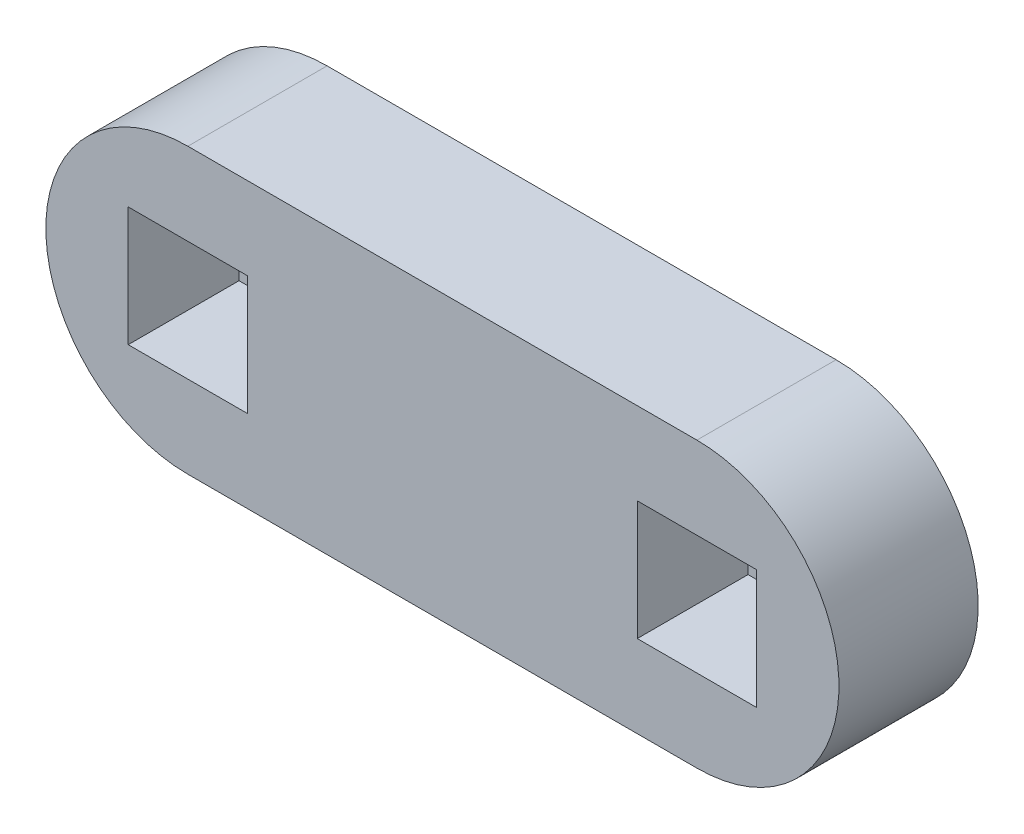
ISO-10303-21;
HEADER;
FILE_DESCRIPTION(('STEP AP214'),'2;1');
FILE_NAME('part.step','',(''),(''),'','','');
FILE_SCHEMA(('AUTOMOTIVE_DESIGN { 1 0 10303 214 1 1 1 1 }'));
ENDSEC;
DATA;
#1=APPLICATION_CONTEXT('core data for automotive mechanical design processes');
#2=APPLICATION_PROTOCOL_DEFINITION('international standard','automotive_design',2000,#1);
#3=PRODUCT_CONTEXT('',#1,'mechanical');
#4=PRODUCT('Part','Part','',(#3));
#5=PRODUCT_RELATED_PRODUCT_CATEGORY('part','',(#4));
#6=PRODUCT_DEFINITION_FORMATION('','',#4);
#7=PRODUCT_DEFINITION_CONTEXT('part definition',#1,'design');
#8=PRODUCT_DEFINITION('design','',#6,#7);
#9=PRODUCT_DEFINITION_SHAPE('','',#8);
#10=(LENGTH_UNIT() NAMED_UNIT(*) SI_UNIT(.MILLI.,.METRE.));
#11=(NAMED_UNIT(*) PLANE_ANGLE_UNIT() SI_UNIT($,.RADIAN.));
#12=(NAMED_UNIT(*) SI_UNIT($,.STERADIAN.) SOLID_ANGLE_UNIT());
#13=UNCERTAINTY_MEASURE_WITH_UNIT(LENGTH_MEASURE(1.E-05),#10,'distance_accuracy_value','');
#14=(GEOMETRIC_REPRESENTATION_CONTEXT(3) GLOBAL_UNCERTAINTY_ASSIGNED_CONTEXT((#13)) GLOBAL_UNIT_ASSIGNED_CONTEXT((#10,
#11,#12)) REPRESENTATION_CONTEXT('',''));
#15=CARTESIAN_POINT('',(0.,0.,0.));
#16=DIRECTION('',(0.,0.,1.));
#17=DIRECTION('',(1.,0.,0.));
#18=AXIS2_PLACEMENT_3D('',#15,#16,#17);
#19=CARTESIAN_POINT('',(-80.8551645809469,-10.4898062034838,247.548483736321));
#20=DIRECTION('',(0.,-1.,3.56992213568219E-13));
#21=DIRECTION('',(0.,-3.56992213568219E-13,-1.));
#22=AXIS2_PLACEMENT_3D('',#19,#20,#21);
#23=PLANE('',#22);
#24=DIRECTION('',(1.,0.,-1.90958360235527E-13));
#25=VECTOR('',#24,1.);
#26=CARTESIAN_POINT('',(-80.8551645810035,-10.4898062035897,-48.9999899999726));
#27=LINE('',#26,#25);
#28=CARTESIAN_POINT('',(-260.034313650781,-10.4898062035897,-48.9999899999554));
#29=VERTEX_POINT('',#28);
#30=CARTESIAN_POINT('',(-80.8551645809469,-10.4898062035897,-48.9999899999726));
#31=VERTEX_POINT('',#30);
#32=EDGE_CURVE('E11',#29,#31,#27,.T.);
#33=ORIENTED_EDGE('',*,*,#32,.F.);
#34=DIRECTION('',(-1.90958360235527E-13,-3.56992213568219E-13,-1.));
#35=VECTOR('',#34,1.);
#36=CARTESIAN_POINT('',(-260.034313650724,-10.4898062034838,247.548483736355));
#37=LINE('',#36,#35);
#38=CARTESIAN_POINT('',(-260.03431365079,-10.4898062036072,-97.9999899999384));
#39=VERTEX_POINT('',#38);
#40=EDGE_CURVE('E138',#29,#39,#37,.T.);
#41=ORIENTED_EDGE('',*,*,#40,.T.);
#42=DIRECTION('',(-1.,0.,1.9099669192392E-13));
#43=VECTOR('',#42,1.);
#44=CARTESIAN_POINT('',(-80.8551645810129,-10.4898062036072,-97.9999899999726));
#45=LINE('',#44,#43);
#46=CARTESIAN_POINT('',(-80.8551645810129,-10.4898062036072,-97.9999899999726));
#47=VERTEX_POINT('',#46);
#48=EDGE_CURVE('E152',#47,#39,#45,.T.);
#49=ORIENTED_EDGE('',*,*,#48,.F.);
#50=DIRECTION('',(-1.90958360235527E-13,-3.56992213568219E-13,-1.));
#51=VECTOR('',#50,1.);
#52=CARTESIAN_POINT('',(-80.8551645809469,-10.4898062034838,247.548483736321));
#53=LINE('',#52,#51);
#54=EDGE_CURVE('E215',#31,#47,#53,.T.);
#55=ORIENTED_EDGE('',*,*,#54,.F.);
#56=EDGE_LOOP('',(#33,#41,#49,#55));
#57=FACE_BOUND('',#56,.T.);
#58=ADVANCED_FACE('F33',(#57),#23,.T.);
#59=CARTESIAN_POINT('',(-260.034313650724,39.5101937965162,247.548483736337));
#60=DIRECTION('',(-1.90958360235527E-13,-3.56992213568219E-13,-1.));
#61=DIRECTION('',(0.,1.,-3.56992213568219E-13));
#62=AXIS2_PLACEMENT_3D('',#59,#60,#61);
#63=CYLINDRICAL_SURFACE('',#62,50.);
#64=CARTESIAN_POINT('',(-260.034313650781,39.5101937964103,-48.9999899999562));
#65=DIRECTION('',(-1.90958360235527E-13,-3.56744395928794E-13,-1.));
#66=DIRECTION('',(0.,1.,-3.56744395928794E-13));
#67=AXIS2_PLACEMENT_3D('',#64,#65,#66);
#68=CIRCLE('',#67,50.);
#69=CARTESIAN_POINT('',(-260.034313650781,89.5101937964103,-48.9999899999741));
#70=VERTEX_POINT('',#69);
#71=EDGE_CURVE('E134',#70,#29,#68,.F.);
#72=ORIENTED_EDGE('',*,*,#71,.F.);
#73=DIRECTION('',(-1.90958360235527E-13,-3.56992213568219E-13,-1.));
#74=VECTOR('',#73,1.);
#75=CARTESIAN_POINT('',(-260.034313650724,89.5101937965162,247.548483736319));
#76=LINE('',#75,#74);
#77=CARTESIAN_POINT('',(-260.03431365079,89.5101937963928,-97.999989999974));
#78=VERTEX_POINT('',#77);
#79=EDGE_CURVE('E128',#70,#78,#76,.T.);
#80=ORIENTED_EDGE('',*,*,#79,.T.);
#81=CARTESIAN_POINT('',(-260.03431365079,39.5101937963928,-97.9999899999562));
#82=DIRECTION('',(-1.90958360235527E-13,-3.56992213568219E-13,-1.));
#83=DIRECTION('',(0.,1.,-3.56992213568219E-13));
#84=AXIS2_PLACEMENT_3D('',#81,#82,#83);
#85=CIRCLE('',#84,50.);
#86=EDGE_CURVE('E133',#39,#78,#85,.T.);
#87=ORIENTED_EDGE('',*,*,#86,.F.);
#88=ORIENTED_EDGE('',*,*,#40,.F.);
#89=EDGE_LOOP('',(#72,#80,#87,#88));
#90=FACE_BOUND('',#89,.T.);
#91=ADVANCED_FACE('F130',(#90),#63,.T.);
#92=CARTESIAN_POINT('',(-80.8551645809469,89.5101937965162,247.548483736285));
#93=DIRECTION('',(0.,1.,-3.56992213568219E-13));
#94=DIRECTION('',(0.,3.56992213568219E-13,1.));
#95=AXIS2_PLACEMENT_3D('',#92,#93,#94);
#96=PLANE('',#95);
#97=DIRECTION('',(-1.,0.,1.90958360235527E-13));
#98=VECTOR('',#97,1.);
#99=CARTESIAN_POINT('',(-80.8551645810035,89.5101937964103,-48.9999900000083));
#100=LINE('',#99,#98);
#101=CARTESIAN_POINT('',(-80.8551645809469,89.5101937964103,-48.9999900000083));
#102=VERTEX_POINT('',#101);
#103=EDGE_CURVE('E173',#102,#70,#100,.T.);
#104=ORIENTED_EDGE('',*,*,#103,.F.);
#105=DIRECTION('',(-1.90958360235527E-13,-3.56992213568219E-13,-1.));
#106=VECTOR('',#105,1.);
#107=CARTESIAN_POINT('',(-80.8551645809469,89.5101937965162,247.548483736285));
#108=LINE('',#107,#106);
#109=CARTESIAN_POINT('',(-80.8551645810129,89.5101937963928,-97.9999900000083));
#110=VERTEX_POINT('',#109);
#111=EDGE_CURVE('E137',#102,#110,#108,.T.);
#112=ORIENTED_EDGE('',*,*,#111,.T.);
#113=DIRECTION('',(1.,0.,-1.9099669192392E-13));
#114=VECTOR('',#113,1.);
#115=CARTESIAN_POINT('',(-260.03431365079,89.5101937963928,-97.999989999974));
#116=LINE('',#115,#114);
#117=EDGE_CURVE('E141',#78,#110,#116,.T.);
#118=ORIENTED_EDGE('',*,*,#117,.F.);
#119=ORIENTED_EDGE('',*,*,#79,.F.);
#120=EDGE_LOOP('',(#104,#112,#118,#119));
#121=FACE_BOUND('',#120,.T.);
#122=ADVANCED_FACE('F142',(#121),#96,.T.);
#123=CARTESIAN_POINT('',(-80.8551645809468,39.5101937965162,247.548483736303));
#124=DIRECTION('',(-1.90958360235527E-13,-3.56992213568219E-13,-1.));
#125=DIRECTION('',(0.,1.,-3.56992213568219E-13));
#126=AXIS2_PLACEMENT_3D('',#123,#124,#125);
#127=CYLINDRICAL_SURFACE('',#126,50.);
#128=CARTESIAN_POINT('',(-80.8551645810035,39.5101937964103,-48.9999899999904));
#129=DIRECTION('',(-1.90958360235527E-13,-3.56744395928794E-13,-1.));
#130=DIRECTION('',(0.,1.,-3.56744395928794E-13));
#131=AXIS2_PLACEMENT_3D('',#128,#129,#130);
#132=CIRCLE('',#131,50.);
#133=EDGE_CURVE('E166',#31,#102,#132,.F.);
#134=ORIENTED_EDGE('',*,*,#133,.F.);
#135=ORIENTED_EDGE('',*,*,#54,.T.);
#136=CARTESIAN_POINT('',(-80.8551645810128,39.5101937963928,-97.9999899999904));
#137=DIRECTION('',(-1.90958360235527E-13,-3.56992213568219E-13,-1.));
#138=DIRECTION('',(0.,1.,-3.56992213568219E-13));
#139=AXIS2_PLACEMENT_3D('',#136,#137,#138);
#140=CIRCLE('',#139,50.);
#141=EDGE_CURVE('E147',#110,#47,#140,.T.);
#142=ORIENTED_EDGE('',*,*,#141,.F.);
#143=ORIENTED_EDGE('',*,*,#111,.F.);
#144=EDGE_LOOP('',(#134,#135,#142,#143));
#145=FACE_BOUND('',#144,.T.);
#146=ADVANCED_FACE('F35',(#145),#127,.T.);
#147=CARTESIAN_POINT('',(-281.034313650724,18.5101937965162,247.548483736349));
#148=DIRECTION('',(-1.,0.,1.90958360235527E-13));
#149=DIRECTION('',(1.90958360235527E-13,0.,1.));
#150=AXIS2_PLACEMENT_3D('',#147,#148,#149);
#151=PLANE('',#150);
#152=DIRECTION('',(-1.90958360235527E-13,-3.56992213568219E-13,-1.));
#153=VECTOR('',#152,1.);
#154=CARTESIAN_POINT('',(-281.034313650724,60.5101937965162,247.548483736334));
#155=LINE('',#154,#153);
#156=CARTESIAN_POINT('',(-281.034313650781,60.5101937965162,-48.9999899999597));
#157=VERTEX_POINT('',#156);
#158=CARTESIAN_POINT('',(-281.034313650788,60.5101937963964,-87.9999899999597));
#159=VERTEX_POINT('',#158);
#160=EDGE_CURVE('E219',#157,#159,#155,.T.);
#161=ORIENTED_EDGE('',*,*,#160,.F.);
#162=DIRECTION('',(0.,-1.,3.56744395928794E-13));
#163=VECTOR('',#162,1.);
#164=CARTESIAN_POINT('',(-281.034313650781,18.5101937964104,-48.9999899999448));
#165=LINE('',#164,#163);
#166=CARTESIAN_POINT('',(-281.034313650781,18.5101937964103,-48.9999899999521));
#167=VERTEX_POINT('',#166);
#168=EDGE_CURVE('E52',#157,#167,#165,.T.);
#169=ORIENTED_EDGE('',*,*,#168,.T.);
#170=DIRECTION('',(-1.90958360235527E-13,-3.56992213568219E-13,-1.));
#171=VECTOR('',#170,1.);
#172=CARTESIAN_POINT('',(-281.034313650724,18.5101937965162,247.548483736349));
#173=LINE('',#172,#171);
#174=CARTESIAN_POINT('',(-281.034313650788,18.5101937963964,-87.9999899999447));
#175=VERTEX_POINT('',#174);
#176=EDGE_CURVE('E211',#167,#175,#173,.T.);
#177=ORIENTED_EDGE('',*,*,#176,.T.);
#178=DIRECTION('',(0.,1.,-3.57187824291606E-13));
#179=VECTOR('',#178,1.);
#180=CARTESIAN_POINT('',(-281.034313650788,18.5101937963964,-87.9999899999447));
#181=LINE('',#180,#179);
#182=EDGE_CURVE('E202',#175,#159,#181,.T.);
#183=ORIENTED_EDGE('',*,*,#182,.T.);
#184=EDGE_LOOP('',(#161,#169,#177,#183));
#185=FACE_BOUND('',#184,.T.);
#186=ADVANCED_FACE('F261',(#185),#151,.F.);
#187=CARTESIAN_POINT('',(-281.034313650724,60.5101937965162,247.548483736334));
#188=DIRECTION('',(0.,1.,-3.56992213568219E-13));
#189=DIRECTION('',(0.,3.56992213568219E-13,1.));
#190=AXIS2_PLACEMENT_3D('',#187,#188,#189);
#191=PLANE('',#190);
#192=DIRECTION('',(-1.90958360235527E-13,-3.56992213568219E-13,-1.));
#193=VECTOR('',#192,1.);
#194=CARTESIAN_POINT('',(-239.034313650724,60.5101937965162,247.548483736325));
#195=LINE('',#194,#193);
#196=CARTESIAN_POINT('',(-239.034313650724,60.5101937964103,-48.9999899999677));
#197=VERTEX_POINT('',#196);
#198=CARTESIAN_POINT('',(-239.034313650788,60.5101937963964,-87.9999899999677));
#199=VERTEX_POINT('',#198);
#200=EDGE_CURVE('E216',#197,#199,#195,.T.);
#201=ORIENTED_EDGE('',*,*,#200,.F.);
#202=DIRECTION('',(-1.,0.,1.90958360235527E-13));
#203=VECTOR('',#202,1.);
#204=CARTESIAN_POINT('',(-281.034313650781,60.5101937964103,-48.9999899999597));
#205=LINE('',#204,#203);
#206=EDGE_CURVE('E43',#197,#157,#205,.T.);
#207=ORIENTED_EDGE('',*,*,#206,.T.);
#208=ORIENTED_EDGE('',*,*,#160,.T.);
#209=DIRECTION('',(1.,0.,-1.90654370597832E-13));
#210=VECTOR('',#209,1.);
#211=CARTESIAN_POINT('',(-281.034313650788,60.5101937963964,-87.9999899999597));
#212=LINE('',#211,#210);
#213=EDGE_CURVE('E205',#159,#199,#212,.T.);
#214=ORIENTED_EDGE('',*,*,#213,.T.);
#215=EDGE_LOOP('',(#201,#207,#208,#214));
#216=FACE_BOUND('',#215,.T.);
#217=ADVANCED_FACE('F264',(#216),#191,.F.);
#218=CARTESIAN_POINT('',(-239.034313650724,60.5101937965162,247.548483736325));
#219=DIRECTION('',(1.,0.,-1.90958360235527E-13));
#220=DIRECTION('',(-1.90958360235527E-13,0.,-1.));
#221=AXIS2_PLACEMENT_3D('',#218,#219,#220);
#222=PLANE('',#221);
#223=DIRECTION('',(-1.90958360235527E-13,-3.56992213568219E-13,-1.));
#224=VECTOR('',#223,1.);
#225=CARTESIAN_POINT('',(-239.034313650724,18.5101937965162,247.54848373634));
#226=LINE('',#225,#224);
#227=CARTESIAN_POINT('',(-239.034313650781,18.5101937963964,-48.9999899999527));
#228=VERTEX_POINT('',#227);
#229=CARTESIAN_POINT('',(-239.034313650788,18.5101937963964,-87.9999899999527));
#230=VERTEX_POINT('',#229);
#231=EDGE_CURVE('E212',#228,#230,#226,.T.);
#232=ORIENTED_EDGE('',*,*,#231,.F.);
#233=DIRECTION('',(0.,1.,-3.56744395928794E-13));
#234=VECTOR('',#233,1.);
#235=CARTESIAN_POINT('',(-239.034313650781,60.5101937964104,-48.9999899999677));
#236=LINE('',#235,#234);
#237=EDGE_CURVE('E72',#228,#197,#236,.T.);
#238=ORIENTED_EDGE('',*,*,#237,.T.);
#239=ORIENTED_EDGE('',*,*,#200,.T.);
#240=DIRECTION('',(0.,-1.,3.56857400772372E-13));
#241=VECTOR('',#240,1.);
#242=CARTESIAN_POINT('',(-239.034313650788,60.5101937963964,-87.9999899999677));
#243=LINE('',#242,#241);
#244=EDGE_CURVE('E208',#199,#230,#243,.T.);
#245=ORIENTED_EDGE('',*,*,#244,.T.);
#246=EDGE_LOOP('',(#232,#238,#239,#245));
#247=FACE_BOUND('',#246,.T.);
#248=ADVANCED_FACE('F259',(#247),#222,.F.);
#249=CARTESIAN_POINT('',(-239.034313650724,18.5101937965162,247.54848373634));
#250=DIRECTION('',(0.,-1.,3.56992213568219E-13));
#251=DIRECTION('',(0.,-3.56992213568219E-13,-1.));
#252=AXIS2_PLACEMENT_3D('',#249,#250,#251);
#253=PLANE('',#252);
#254=ORIENTED_EDGE('',*,*,#176,.F.);
#255=DIRECTION('',(1.,0.,-1.90958360235527E-13));
#256=VECTOR('',#255,1.);
#257=CARTESIAN_POINT('',(-239.034313650781,18.5101937964103,-48.9999899999527));
#258=LINE('',#257,#256);
#259=EDGE_CURVE('E159',#167,#228,#258,.T.);
#260=ORIENTED_EDGE('',*,*,#259,.T.);
#261=ORIENTED_EDGE('',*,*,#231,.T.);
#262=DIRECTION('',(-1.,0.,1.90984794117066E-13));
#263=VECTOR('',#262,1.);
#264=CARTESIAN_POINT('',(-239.034313650788,18.5101937963964,-87.9999899999527));
#265=LINE('',#264,#263);
#266=EDGE_CURVE('E191',#230,#175,#265,.T.);
#267=ORIENTED_EDGE('',*,*,#266,.T.);
#268=EDGE_LOOP('',(#254,#260,#261,#267));
#269=FACE_BOUND('',#268,.T.);
#270=ADVANCED_FACE('F255',(#269),#253,.F.);
#271=CARTESIAN_POINT('',(-59.8551645809469,60.5101937965162,247.548483736291));
#272=DIRECTION('',(1.,0.,-1.90958360235527E-13));
#273=DIRECTION('',(-1.90958360235527E-13,0.,-1.));
#274=AXIS2_PLACEMENT_3D('',#271,#272,#273);
#275=PLANE('',#274);
#276=DIRECTION('',(-1.90958360235527E-13,-3.56992213568219E-13,-1.));
#277=VECTOR('',#276,1.);
#278=CARTESIAN_POINT('',(-59.8551645809469,18.5101937965162,247.548483736306));
#279=LINE('',#278,#277);
#280=CARTESIAN_POINT('',(-59.8551645810035,18.5101937963964,-48.9999899999869));
#281=VERTEX_POINT('',#280);
#282=CARTESIAN_POINT('',(-59.855164581011,18.5101937963964,-87.9999899999869));
#283=VERTEX_POINT('',#282);
#284=EDGE_CURVE('E195',#281,#283,#279,.T.);
#285=ORIENTED_EDGE('',*,*,#284,.F.);
#286=DIRECTION('',(0.,1.,-3.56744395928794E-13));
#287=VECTOR('',#286,1.);
#288=CARTESIAN_POINT('',(-59.8551645810035,60.5101937964104,-48.9999900000019));
#289=LINE('',#288,#287);
#290=CARTESIAN_POINT('',(-59.8551645810035,60.5101937964103,-48.9999899999943));
#291=VERTEX_POINT('',#290);
#292=EDGE_CURVE('E37',#281,#291,#289,.T.);
#293=ORIENTED_EDGE('',*,*,#292,.T.);
#294=DIRECTION('',(-1.90958360235527E-13,-3.56992213568219E-13,-1.));
#295=VECTOR('',#294,1.);
#296=CARTESIAN_POINT('',(-59.8551645809469,60.5101937965162,247.548483736291));
#297=LINE('',#296,#295);
#298=CARTESIAN_POINT('',(-59.855164581011,60.5101937965162,-87.9999900000019));
#299=VERTEX_POINT('',#298);
#300=EDGE_CURVE('E187',#291,#299,#297,.T.);
#301=ORIENTED_EDGE('',*,*,#300,.T.);
#302=DIRECTION('',(0.,-1.,3.56857400772372E-13));
#303=VECTOR('',#302,1.);
#304=CARTESIAN_POINT('',(-59.855164581011,60.5101937963964,-87.9999900000019));
#305=LINE('',#304,#303);
#306=EDGE_CURVE('E178',#299,#283,#305,.T.);
#307=ORIENTED_EDGE('',*,*,#306,.T.);
#308=EDGE_LOOP('',(#285,#293,#301,#307));
#309=FACE_BOUND('',#308,.T.);
#310=ADVANCED_FACE('F258',(#309),#275,.F.);
#311=CARTESIAN_POINT('',(-59.8551645809469,18.5101937965162,247.548483736306));
#312=DIRECTION('',(0.,-1.,3.56992213568219E-13));
#313=DIRECTION('',(0.,-3.56992213568219E-13,-1.));
#314=AXIS2_PLACEMENT_3D('',#311,#312,#313);
#315=PLANE('',#314);
#316=DIRECTION('',(-1.90958360235527E-13,-3.56992213568219E-13,-1.));
#317=VECTOR('',#316,1.);
#318=CARTESIAN_POINT('',(-101.855164580947,18.5101937965162,247.548483736314));
#319=LINE('',#318,#317);
#320=CARTESIAN_POINT('',(-101.855164581011,18.5101937964103,-48.9999899999789));
#321=VERTEX_POINT('',#320);
#322=CARTESIAN_POINT('',(-101.855164581011,18.5101937963964,-87.9999899999789));
#323=VERTEX_POINT('',#322);
#324=EDGE_CURVE('E192',#321,#323,#319,.T.);
#325=ORIENTED_EDGE('',*,*,#324,.F.);
#326=DIRECTION('',(1.,0.,-1.90958360235527E-13));
#327=VECTOR('',#326,1.);
#328=CARTESIAN_POINT('',(-59.8551645810035,18.5101937964103,-48.999989999987));
#329=LINE('',#328,#327);
#330=EDGE_CURVE('E66',#321,#281,#329,.T.);
#331=ORIENTED_EDGE('',*,*,#330,.T.);
#332=ORIENTED_EDGE('',*,*,#284,.T.);
#333=DIRECTION('',(-1.,0.,1.90984794117066E-13));
#334=VECTOR('',#333,1.);
#335=CARTESIAN_POINT('',(-59.855164581011,18.5101937963964,-87.9999899999869));
#336=LINE('',#335,#334);
#337=EDGE_CURVE('E181',#283,#323,#336,.T.);
#338=ORIENTED_EDGE('',*,*,#337,.T.);
#339=EDGE_LOOP('',(#325,#331,#332,#338));
#340=FACE_BOUND('',#339,.T.);
#341=ADVANCED_FACE('F274',(#340),#315,.F.);
#342=CARTESIAN_POINT('',(-101.855164580947,18.5101937965162,247.548483736314));
#343=DIRECTION('',(-1.,0.,1.90958360235527E-13));
#344=DIRECTION('',(1.90958360235527E-13,0.,1.));
#345=AXIS2_PLACEMENT_3D('',#342,#343,#344);
#346=PLANE('',#345);
#347=DIRECTION('',(-1.90958360235527E-13,-3.56992213568219E-13,-1.));
#348=VECTOR('',#347,1.);
#349=CARTESIAN_POINT('',(-101.855164580947,60.5101937965162,247.548483736299));
#350=LINE('',#349,#348);
#351=CARTESIAN_POINT('',(-101.855164581004,60.5101937965162,-48.9999899999939));
#352=VERTEX_POINT('',#351);
#353=CARTESIAN_POINT('',(-101.855164581011,60.5101937963964,-87.9999899999939));
#354=VERTEX_POINT('',#353);
#355=EDGE_CURVE('E188',#352,#354,#350,.T.);
#356=ORIENTED_EDGE('',*,*,#355,.F.);
#357=DIRECTION('',(0.,-1.,3.56744395928794E-13));
#358=VECTOR('',#357,1.);
#359=CARTESIAN_POINT('',(-101.855164581004,18.5101937964104,-48.9999899999789));
#360=LINE('',#359,#358);
#361=EDGE_CURVE('E160',#352,#321,#360,.T.);
#362=ORIENTED_EDGE('',*,*,#361,.T.);
#363=ORIENTED_EDGE('',*,*,#324,.T.);
#364=DIRECTION('',(0.,1.,-3.56857400772372E-13));
#365=VECTOR('',#364,1.);
#366=CARTESIAN_POINT('',(-101.855164581011,18.5101937963964,-87.9999899999789));
#367=LINE('',#366,#365);
#368=EDGE_CURVE('E184',#323,#354,#367,.T.);
#369=ORIENTED_EDGE('',*,*,#368,.T.);
#370=EDGE_LOOP('',(#356,#362,#363,#369));
#371=FACE_BOUND('',#370,.T.);
#372=ADVANCED_FACE('F243',(#371),#346,.F.);
#373=CARTESIAN_POINT('',(-101.855164580947,60.5101937965162,247.548483736299));
#374=DIRECTION('',(0.,1.,-3.56992213568219E-13));
#375=DIRECTION('',(0.,3.56992213568219E-13,1.));
#376=AXIS2_PLACEMENT_3D('',#373,#374,#375);
#377=PLANE('',#376);
#378=ORIENTED_EDGE('',*,*,#300,.F.);
#379=DIRECTION('',(-1.,0.,1.90958360235527E-13));
#380=VECTOR('',#379,1.);
#381=CARTESIAN_POINT('',(-101.855164581004,60.5101937964103,-48.9999899999939));
#382=LINE('',#381,#380);
#383=EDGE_CURVE('E163',#291,#352,#382,.T.);
#384=ORIENTED_EDGE('',*,*,#383,.T.);
#385=ORIENTED_EDGE('',*,*,#355,.T.);
#386=DIRECTION('',(1.,0.,-1.90984794117066E-13));
#387=VECTOR('',#386,1.);
#388=CARTESIAN_POINT('',(-101.855164581011,60.5101937963964,-87.9999899999939));
#389=LINE('',#388,#387);
#390=EDGE_CURVE('E157',#354,#299,#389,.T.);
#391=ORIENTED_EDGE('',*,*,#390,.T.);
#392=EDGE_LOOP('',(#378,#384,#385,#391));
#393=FACE_BOUND('',#392,.T.);
#394=ADVANCED_FACE('F234',(#393),#377,.F.);
#395=CARTESIAN_POINT('',(-101.855164581004,39.5101937964103,-48.9999899999864));
#396=DIRECTION('',(-1.90958360235527E-13,-3.56744395928794E-13,-1.));
#397=DIRECTION('',(0.,-1.,3.56744395928794E-13));
#398=AXIS2_PLACEMENT_3D('',#395,#396,#397);
#399=PLANE('',#398);
#400=ORIENTED_EDGE('',*,*,#133,.T.);
#401=ORIENTED_EDGE('',*,*,#103,.T.);
#402=ORIENTED_EDGE('',*,*,#71,.T.);
#403=ORIENTED_EDGE('',*,*,#32,.T.);
#404=EDGE_LOOP('',(#400,#401,#402,#403));
#405=FACE_BOUND('',#404,.T.);
#406=ORIENTED_EDGE('',*,*,#292,.F.);
#407=ORIENTED_EDGE('',*,*,#330,.F.);
#408=ORIENTED_EDGE('',*,*,#361,.F.);
#409=ORIENTED_EDGE('',*,*,#383,.F.);
#410=EDGE_LOOP('',(#406,#407,#408,#409));
#411=FACE_BOUND('',#410,.T.);
#412=ORIENTED_EDGE('',*,*,#168,.F.);
#413=ORIENTED_EDGE('',*,*,#206,.F.);
#414=ORIENTED_EDGE('',*,*,#237,.F.);
#415=ORIENTED_EDGE('',*,*,#259,.F.);
#416=EDGE_LOOP('',(#412,#413,#414,#415));
#417=FACE_BOUND('',#416,.T.);
#418=ADVANCED_FACE('F231',(#405,#411,#417),#399,.F.);
#419=CARTESIAN_POINT('',(-260.034313650788,39.5101937963964,-87.9999899999562));
#420=DIRECTION('',(-1.90958360235527E-13,-3.56992213568219E-13,-1.));
#421=DIRECTION('',(0.,1.,-3.56992213568219E-13));
#422=AXIS2_PLACEMENT_3D('',#419,#420,#421);
#423=PLANE('',#422);
#424=ORIENTED_EDGE('',*,*,#266,.F.);
#425=ORIENTED_EDGE('',*,*,#244,.F.);
#426=ORIENTED_EDGE('',*,*,#213,.F.);
#427=ORIENTED_EDGE('',*,*,#182,.F.);
#428=EDGE_LOOP('',(#424,#425,#426,#427));
#429=FACE_BOUND('',#428,.T.);
#430=ADVANCED_FACE('F233',(#429),#423,.F.);
#431=ORIENTED_EDGE('',*,*,#390,.F.);
#432=ORIENTED_EDGE('',*,*,#368,.F.);
#433=ORIENTED_EDGE('',*,*,#337,.F.);
#434=ORIENTED_EDGE('',*,*,#306,.F.);
#435=EDGE_LOOP('',(#431,#432,#433,#434));
#436=FACE_BOUND('',#435,.T.);
#437=ADVANCED_FACE('F240',(#436),#423,.F.);
#438=CARTESIAN_POINT('',(-260.03431365079,39.5101937963928,-97.9999899999562));
#439=DIRECTION('',(-1.90958360235527E-13,-3.56992213568219E-13,-1.));
#440=DIRECTION('',(0.,1.,-3.56992213568219E-13));
#441=AXIS2_PLACEMENT_3D('',#438,#439,#440);
#442=PLANE('',#441);
#443=ORIENTED_EDGE('',*,*,#86,.T.);
#444=ORIENTED_EDGE('',*,*,#117,.T.);
#445=ORIENTED_EDGE('',*,*,#141,.T.);
#446=ORIENTED_EDGE('',*,*,#48,.T.);
#447=EDGE_LOOP('',(#443,#444,#445,#446));
#448=FACE_BOUND('',#447,.T.);
#449=ADVANCED_FACE('F150',(#448),#442,.T.);
#450=CLOSED_SHELL('',(#58,#91,#122,#146,#186,#217,#248,#270,#310,#341,#372,#394,#418,#430,#437,#449));
#451=MANIFOLD_SOLID_BREP('B2',#450);
#452=ADVANCED_BREP_SHAPE_REPRESENTATION('',(#18,#451),#14);
#453=SHAPE_DEFINITION_REPRESENTATION(#9,#452);
ENDSEC;
END-ISO-10303-21;
